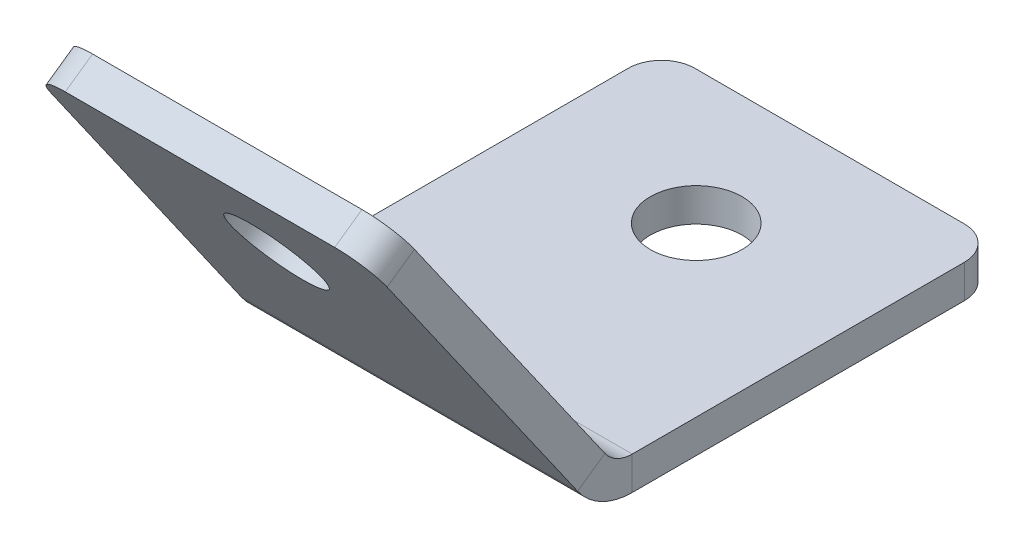
ISO-10303-21;
HEADER;
FILE_DESCRIPTION(('STEP AP214'),'2;1');
FILE_NAME('part.step','',(''),(''),'','','');
FILE_SCHEMA(('AUTOMOTIVE_DESIGN { 1 0 10303 214 1 1 1 1 }'));
ENDSEC;
DATA;
#1=APPLICATION_CONTEXT('core data for automotive mechanical design processes');
#2=APPLICATION_PROTOCOL_DEFINITION('international standard','automotive_design',2000,#1);
#3=PRODUCT_CONTEXT('',#1,'mechanical');
#4=PRODUCT('Part','Part','',(#3));
#5=PRODUCT_RELATED_PRODUCT_CATEGORY('part','',(#4));
#6=PRODUCT_DEFINITION_FORMATION('','',#4);
#7=PRODUCT_DEFINITION_CONTEXT('part definition',#1,'design');
#8=PRODUCT_DEFINITION('design','',#6,#7);
#9=PRODUCT_DEFINITION_SHAPE('','',#8);
#10=(LENGTH_UNIT() NAMED_UNIT(*) SI_UNIT(.MILLI.,.METRE.));
#11=(NAMED_UNIT(*) PLANE_ANGLE_UNIT() SI_UNIT($,.RADIAN.));
#12=(NAMED_UNIT(*) SI_UNIT($,.STERADIAN.) SOLID_ANGLE_UNIT());
#13=UNCERTAINTY_MEASURE_WITH_UNIT(LENGTH_MEASURE(1.E-05),#10,'distance_accuracy_value','');
#14=(GEOMETRIC_REPRESENTATION_CONTEXT(3) GLOBAL_UNCERTAINTY_ASSIGNED_CONTEXT((#13)) GLOBAL_UNIT_ASSIGNED_CONTEXT((#10,
#11,#12)) REPRESENTATION_CONTEXT('',''));
#15=CARTESIAN_POINT('',(0.,0.,0.));
#16=DIRECTION('',(0.,0.,1.));
#17=DIRECTION('',(1.,0.,0.));
#18=AXIS2_PLACEMENT_3D('',#15,#16,#17);
#19=CARTESIAN_POINT('',(32.004,2.70778962917083,1.89601471023151));
#20=DIRECTION('',(1.,0.,0.));
#21=DIRECTION('',(0.,0.,-1.));
#22=AXIS2_PLACEMENT_3D('',#19,#20,#21);
#23=PLANE('',#22);
#24=DIRECTION('',(0.,0.57357643635105,-0.819152044288989));
#25=VECTOR('',#24,1.);
#26=CARTESIAN_POINT('',(32.004,2.70778962917083,1.89601471023151));
#27=LINE('',#26,#25);
#28=CARTESIAN_POINT('',(32.004,2.70778962917083,1.89601471023151));
#29=VERTEX_POINT('',#28);
#30=CARTESIAN_POINT('',(32.004,4.52889481458542,-0.704793030386029));
#31=VERTEX_POINT('',#30);
#32=EDGE_CURVE('E137',#29,#31,#27,.T.);
#33=ORIENTED_EDGE('',*,*,#32,.F.);
#34=CARTESIAN_POINT('',(32.004,6.35,-3.30560077100357));
#35=DIRECTION('',(-1.,0.,0.));
#36=DIRECTION('',(0.,0.,1.));
#37=AXIS2_PLACEMENT_3D('',#34,#35,#36);
#38=CIRCLE('',#37,6.35);
#39=CARTESIAN_POINT('',(32.004,0.,-3.30560077100357));
#40=VERTEX_POINT('',#39);
#41=EDGE_CURVE('E135',#29,#40,#38,.F.);
#42=ORIENTED_EDGE('',*,*,#41,.T.);
#43=DIRECTION('',(0.,-1.,0.));
#44=VECTOR('',#43,1.);
#45=CARTESIAN_POINT('',(32.004,3.175,-3.30560077100357));
#46=LINE('',#45,#44);
#47=CARTESIAN_POINT('',(32.004,3.175,-3.30560077100357));
#48=VERTEX_POINT('',#47);
#49=EDGE_CURVE('E129',#48,#40,#46,.T.);
#50=ORIENTED_EDGE('',*,*,#49,.F.);
#51=CARTESIAN_POINT('',(32.004,6.35,-3.30560077100357));
#52=DIRECTION('',(1.,0.,0.));
#53=DIRECTION('',(0.,0.,-1.));
#54=AXIS2_PLACEMENT_3D('',#51,#52,#53);
#55=CIRCLE('',#54,3.175);
#56=EDGE_CURVE('E133',#31,#48,#55,.T.);
#57=ORIENTED_EDGE('',*,*,#56,.F.);
#58=EDGE_LOOP('',(#33,#42,#50,#57));
#59=FACE_BOUND('',#58,.T.);
#60=ADVANCED_FACE('F36',(#59),#23,.T.);
#61=CARTESIAN_POINT('',(32.004,3.175,-3.30560077100357));
#62=DIRECTION('',(1.,0.,0.));
#63=DIRECTION('',(0.,0.,-1.));
#64=AXIS2_PLACEMENT_3D('',#61,#62,#63);
#65=PLANE('',#64);
#66=DIRECTION('',(0.,-0.819152044288989,-0.57357643635105));
#67=VECTOR('',#66,1.);
#68=CARTESIAN_POINT('',(32.004,1.82110518541458,-2.60080774061754));
#69=LINE('',#68,#67);
#70=CARTESIAN_POINT('',(32.004,30.4299903322075,17.4313492989429));
#71=VERTEX_POINT('',#70);
#72=EDGE_CURVE('E158',#71,#31,#69,.T.);
#73=ORIENTED_EDGE('',*,*,#72,.F.);
#74=DIRECTION('',(0.,0.573576436351052,-0.819152044288988));
#75=VECTOR('',#74,1.);
#76=CARTESIAN_POINT('',(32.004,31.2065524951516,16.3223035938231));
#77=LINE('',#76,#75);
#78=CARTESIAN_POINT('',(32.004,28.6088851467929,20.0321570395604));
#79=VERTEX_POINT('',#78);
#80=EDGE_CURVE('E217',#71,#79,#77,.F.);
#81=ORIENTED_EDGE('',*,*,#80,.T.);
#82=DIRECTION('',(0.,-0.819152044288989,-0.57357643635105));
#83=VECTOR('',#82,1.);
#84=CARTESIAN_POINT('',(32.004,0.,0.));
#85=LINE('',#84,#83);
#86=EDGE_CURVE('E160',#79,#29,#85,.T.);
#87=ORIENTED_EDGE('',*,*,#86,.T.);
#88=ORIENTED_EDGE('',*,*,#32,.T.);
#89=EDGE_LOOP('',(#73,#81,#87,#88));
#90=FACE_BOUND('',#89,.T.);
#91=ADVANCED_FACE('F269',(#90),#65,.T.);
#92=CARTESIAN_POINT('',(0.,0.,-3.30560077100357));
#93=DIRECTION('',(-1.,0.,0.));
#94=DIRECTION('',(0.,0.,1.));
#95=AXIS2_PLACEMENT_3D('',#92,#93,#94);
#96=PLANE('',#95);
#97=DIRECTION('',(0.,1.,0.));
#98=VECTOR('',#97,1.);
#99=CARTESIAN_POINT('',(0.,0.,-3.30560077100357));
#100=LINE('',#99,#98);
#101=CARTESIAN_POINT('',(0.,0.,-3.30560077100357));
#102=VERTEX_POINT('',#101);
#103=CARTESIAN_POINT('',(0.,3.175,-3.30560077100357));
#104=VERTEX_POINT('',#103);
#105=EDGE_CURVE('E138',#102,#104,#100,.T.);
#106=ORIENTED_EDGE('',*,*,#105,.F.);
#107=CARTESIAN_POINT('',(0.,6.35,-3.30560077100357));
#108=DIRECTION('',(-1.,0.,0.));
#109=DIRECTION('',(0.,0.,1.));
#110=AXIS2_PLACEMENT_3D('',#107,#108,#109);
#111=CIRCLE('',#110,6.35);
#112=CARTESIAN_POINT('',(0.,2.70778962917083,1.89601471023151));
#113=VERTEX_POINT('',#112);
#114=EDGE_CURVE('E178',#113,#102,#111,.F.);
#115=ORIENTED_EDGE('',*,*,#114,.F.);
#116=DIRECTION('',(0.,-0.57357643635105,0.819152044288989));
#117=VECTOR('',#116,1.);
#118=CARTESIAN_POINT('',(0.,4.52889481458542,-0.704793030386029));
#119=LINE('',#118,#117);
#120=CARTESIAN_POINT('',(0.,4.52889481458542,-0.704793030386029));
#121=VERTEX_POINT('',#120);
#122=EDGE_CURVE('E197',#121,#113,#119,.T.);
#123=ORIENTED_EDGE('',*,*,#122,.F.);
#124=CARTESIAN_POINT('',(0.,6.35,-3.30560077100357));
#125=DIRECTION('',(1.,0.,0.));
#126=DIRECTION('',(0.,0.,-1.));
#127=AXIS2_PLACEMENT_3D('',#124,#125,#126);
#128=CIRCLE('',#127,3.175);
#129=EDGE_CURVE('E172',#121,#104,#128,.T.);
#130=ORIENTED_EDGE('',*,*,#129,.T.);
#131=EDGE_LOOP('',(#106,#115,#123,#130));
#132=FACE_BOUND('',#131,.T.);
#133=ADVANCED_FACE('F265',(#132),#96,.T.);
#134=CARTESIAN_POINT('',(0.,4.52889481458542,-0.704793030386029));
#135=DIRECTION('',(-1.,0.,0.));
#136=DIRECTION('',(0.,0.,1.));
#137=AXIS2_PLACEMENT_3D('',#134,#135,#136);
#138=PLANE('',#137);
#139=DIRECTION('',(0.,0.,-1.));
#140=VECTOR('',#139,1.);
#141=CARTESIAN_POINT('',(0.,3.175,0.));
#142=LINE('',#141,#140);
#143=CARTESIAN_POINT('',(0.,3.175,-34.925));
#144=VERTEX_POINT('',#143);
#145=EDGE_CURVE('E145',#104,#144,#142,.T.);
#146=ORIENTED_EDGE('',*,*,#145,.T.);
#147=DIRECTION('',(0.,-1.,0.));
#148=VECTOR('',#147,1.);
#149=CARTESIAN_POINT('',(0.,4.52889481458542,-34.925));
#150=LINE('',#149,#148);
#151=CARTESIAN_POINT('',(0.,0.,-34.925));
#152=VERTEX_POINT('',#151);
#153=EDGE_CURVE('E11',#144,#152,#150,.T.);
#154=ORIENTED_EDGE('',*,*,#153,.T.);
#155=DIRECTION('',(0.,0.,-1.));
#156=VECTOR('',#155,1.);
#157=CARTESIAN_POINT('',(0.,0.,0.));
#158=LINE('',#157,#156);
#159=EDGE_CURVE('E167',#102,#152,#158,.T.);
#160=ORIENTED_EDGE('',*,*,#159,.F.);
#161=ORIENTED_EDGE('',*,*,#105,.T.);
#162=EDGE_LOOP('',(#146,#154,#160,#161));
#163=FACE_BOUND('',#162,.T.);
#164=ADVANCED_FACE('F258',(#163),#138,.T.);
#165=CARTESIAN_POINT('',(32.004,0.,0.));
#166=DIRECTION('',(0.,1.,0.));
#167=DIRECTION('',(0.,0.,1.));
#168=AXIS2_PLACEMENT_3D('',#165,#166,#167);
#169=PLANE('',#168);
#170=CARTESIAN_POINT('',(16.002,0.,-25.4));
#171=DIRECTION('',(0.,-1.,0.));
#172=DIRECTION('',(0.,0.,-1.));
#173=AXIS2_PLACEMENT_3D('',#170,#171,#172);
#174=CIRCLE('',#173,4.3688);
#175=CARTESIAN_POINT('',(16.002,0.,-29.7688));
#176=VERTEX_POINT('',#175);
#177=EDGE_CURVE('E208',#176,#176,#174,.T.);
#178=ORIENTED_EDGE('',*,*,#177,.F.);
#179=EDGE_LOOP('',(#178));
#180=FACE_BOUND('',#179,.T.);
#181=DIRECTION('',(-1.,0.,0.));
#182=VECTOR('',#181,1.);
#183=CARTESIAN_POINT('',(32.004,0.,-38.1));
#184=LINE('',#183,#182);
#185=CARTESIAN_POINT('',(28.829,0.,-38.1));
#186=VERTEX_POINT('',#185);
#187=CARTESIAN_POINT('',(3.175,0.,-38.1));
#188=VERTEX_POINT('',#187);
#189=EDGE_CURVE('E194',#186,#188,#184,.T.);
#190=ORIENTED_EDGE('',*,*,#189,.F.);
#191=CARTESIAN_POINT('',(28.829,0.,-34.925));
#192=DIRECTION('',(0.,1.,0.));
#193=DIRECTION('',(0.,0.,1.));
#194=AXIS2_PLACEMENT_3D('',#191,#192,#193);
#195=CIRCLE('',#194,3.175);
#196=CARTESIAN_POINT('',(32.004,0.,-34.925));
#197=VERTEX_POINT('',#196);
#198=EDGE_CURVE('E233',#186,#197,#195,.F.);
#199=ORIENTED_EDGE('',*,*,#198,.T.);
#200=DIRECTION('',(0.,0.,-1.));
#201=VECTOR('',#200,1.);
#202=CARTESIAN_POINT('',(32.004,0.,0.));
#203=LINE('',#202,#201);
#204=EDGE_CURVE('E153',#40,#197,#203,.T.);
#205=ORIENTED_EDGE('',*,*,#204,.F.);
#206=DIRECTION('',(-1.,0.,0.));
#207=VECTOR('',#206,1.);
#208=CARTESIAN_POINT('',(32.004,0.,-3.30560077100357));
#209=LINE('',#208,#207);
#210=EDGE_CURVE('E166',#40,#102,#209,.T.);
#211=ORIENTED_EDGE('',*,*,#210,.T.);
#212=ORIENTED_EDGE('',*,*,#159,.T.);
#213=CARTESIAN_POINT('',(3.175,0.,-34.925));
#214=DIRECTION('',(0.,1.,0.));
#215=DIRECTION('',(0.,0.,1.));
#216=AXIS2_PLACEMENT_3D('',#213,#214,#215);
#217=CIRCLE('',#216,3.175);
#218=EDGE_CURVE('E231',#152,#188,#217,.F.);
#219=ORIENTED_EDGE('',*,*,#218,.T.);
#220=EDGE_LOOP('',(#190,#199,#205,#211,#212,#219));
#221=FACE_BOUND('',#220,.T.);
#222=ADVANCED_FACE('F246',(#180,#221),#169,.F.);
#223=CARTESIAN_POINT('',(32.004,3.175,-38.1));
#224=DIRECTION('',(0.,0.,-1.));
#225=DIRECTION('',(-1.,0.,0.));
#226=AXIS2_PLACEMENT_3D('',#223,#224,#225);
#227=PLANE('',#226);
#228=DIRECTION('',(-1.,0.,0.));
#229=VECTOR('',#228,1.);
#230=CARTESIAN_POINT('',(32.004,3.175,-38.1));
#231=LINE('',#230,#229);
#232=CARTESIAN_POINT('',(28.829,3.175,-38.1));
#233=VERTEX_POINT('',#232);
#234=CARTESIAN_POINT('',(3.175,3.175,-38.1));
#235=VERTEX_POINT('',#234);
#236=EDGE_CURVE('E149',#233,#235,#231,.T.);
#237=ORIENTED_EDGE('',*,*,#236,.F.);
#238=DIRECTION('',(0.,-1.,0.));
#239=VECTOR('',#238,1.);
#240=CARTESIAN_POINT('',(28.829,3.175,-38.1));
#241=LINE('',#240,#239);
#242=EDGE_CURVE('E228',#233,#186,#241,.T.);
#243=ORIENTED_EDGE('',*,*,#242,.T.);
#244=ORIENTED_EDGE('',*,*,#189,.T.);
#245=DIRECTION('',(0.,-1.,0.));
#246=VECTOR('',#245,1.);
#247=CARTESIAN_POINT('',(3.175,3.175,-38.1));
#248=LINE('',#247,#246);
#249=EDGE_CURVE('E226',#188,#235,#248,.F.);
#250=ORIENTED_EDGE('',*,*,#249,.T.);
#251=EDGE_LOOP('',(#237,#243,#244,#250));
#252=FACE_BOUND('',#251,.T.);
#253=ADVANCED_FACE('F240',(#252),#227,.T.);
#254=CARTESIAN_POINT('',(32.004,3.175,0.));
#255=DIRECTION('',(0.,1.,0.));
#256=DIRECTION('',(0.,0.,1.));
#257=AXIS2_PLACEMENT_3D('',#254,#255,#256);
#258=PLANE('',#257);
#259=CARTESIAN_POINT('',(16.002,3.175,-25.4));
#260=DIRECTION('',(0.,1.,0.));
#261=DIRECTION('',(0.,0.,1.));
#262=AXIS2_PLACEMENT_3D('',#259,#260,#261);
#263=CIRCLE('',#262,4.3688);
#264=CARTESIAN_POINT('',(16.002,3.175,-21.0312));
#265=VERTEX_POINT('',#264);
#266=EDGE_CURVE('E204',#265,#265,#263,.T.);
#267=ORIENTED_EDGE('',*,*,#266,.F.);
#268=EDGE_LOOP('',(#267));
#269=FACE_BOUND('',#268,.T.);
#270=DIRECTION('',(0.,0.,-1.));
#271=VECTOR('',#270,1.);
#272=CARTESIAN_POINT('',(32.004,3.175,0.));
#273=LINE('',#272,#271);
#274=CARTESIAN_POINT('',(32.004,3.175,-34.925));
#275=VERTEX_POINT('',#274);
#276=EDGE_CURVE('E143',#48,#275,#273,.T.);
#277=ORIENTED_EDGE('',*,*,#276,.T.);
#278=CARTESIAN_POINT('',(28.829,3.175,-34.925));
#279=DIRECTION('',(0.,1.,0.));
#280=DIRECTION('',(0.,0.,1.));
#281=AXIS2_PLACEMENT_3D('',#278,#279,#280);
#282=CIRCLE('',#281,3.175);
#283=EDGE_CURVE('E44',#275,#233,#282,.T.);
#284=ORIENTED_EDGE('',*,*,#283,.T.);
#285=ORIENTED_EDGE('',*,*,#236,.T.);
#286=CARTESIAN_POINT('',(3.175,3.175,-34.925));
#287=DIRECTION('',(0.,1.,0.));
#288=DIRECTION('',(0.,0.,1.));
#289=AXIS2_PLACEMENT_3D('',#286,#287,#288);
#290=CIRCLE('',#289,3.175);
#291=EDGE_CURVE('E51',#235,#144,#290,.T.);
#292=ORIENTED_EDGE('',*,*,#291,.T.);
#293=ORIENTED_EDGE('',*,*,#145,.F.);
#294=DIRECTION('',(-1.,0.,0.));
#295=VECTOR('',#294,1.);
#296=CARTESIAN_POINT('',(32.004,3.175,-3.30560077100357));
#297=LINE('',#296,#295);
#298=EDGE_CURVE('E141',#48,#104,#297,.T.);
#299=ORIENTED_EDGE('',*,*,#298,.F.);
#300=EDGE_LOOP('',(#277,#284,#285,#292,#293,#299));
#301=FACE_BOUND('',#300,.T.);
#302=ADVANCED_FACE('F142',(#269,#301),#258,.T.);
#303=CARTESIAN_POINT('',(32.004,6.35,-3.30560077100357));
#304=DIRECTION('',(-1.,0.,0.));
#305=DIRECTION('',(0.,0.,1.));
#306=AXIS2_PLACEMENT_3D('',#303,#304,#305);
#307=CYLINDRICAL_SURFACE('',#306,3.175);
#308=ORIENTED_EDGE('',*,*,#129,.F.);
#309=DIRECTION('',(-1.,0.,0.));
#310=VECTOR('',#309,1.);
#311=CARTESIAN_POINT('',(32.004,4.52889481458542,-0.704793030386029));
#312=LINE('',#311,#310);
#313=EDGE_CURVE('E150',#31,#121,#312,.T.);
#314=ORIENTED_EDGE('',*,*,#313,.F.);
#315=ORIENTED_EDGE('',*,*,#56,.T.);
#316=ORIENTED_EDGE('',*,*,#298,.T.);
#317=EDGE_LOOP('',(#308,#314,#315,#316));
#318=FACE_BOUND('',#317,.T.);
#319=ADVANCED_FACE('F156',(#318),#307,.F.);
#320=CARTESIAN_POINT('',(32.004,1.82110518541458,-2.60080774061754));
#321=DIRECTION('',(0.,0.57357643635105,-0.819152044288989));
#322=DIRECTION('',(0.,0.819152044288989,0.57357643635105));
#323=AXIS2_PLACEMENT_3D('',#320,#321,#322);
#324=PLANE('',#323);
#325=CARTESIAN_POINT('',(16.002,22.6275671103549,11.9680337426991));
#326=DIRECTION('',(0.,0.57357643635105,-0.819152044288989));
#327=DIRECTION('',(0.,0.819152044288989,0.57357643635105));
#328=AXIS2_PLACEMENT_3D('',#325,#326,#327);
#329=CIRCLE('',#328,4.3688);
#330=CARTESIAN_POINT('',(16.002,19.0488556592652,9.46219300756867));
#331=VERTEX_POINT('',#330);
#332=EDGE_CURVE('E170',#331,#331,#329,.T.);
#333=ORIENTED_EDGE('',*,*,#332,.F.);
#334=EDGE_LOOP('',(#333));
#335=FACE_BOUND('',#334,.T.);
#336=DIRECTION('',(-1.,0.,0.));
#337=VECTOR('',#336,1.);
#338=CARTESIAN_POINT('',(32.004,33.0307980728251,19.2524544843575));
#339=LINE('',#338,#337);
#340=CARTESIAN_POINT('',(28.829,33.0307980728251,19.2524544843575));
#341=VERTEX_POINT('',#340);
#342=CARTESIAN_POINT('',(3.175,33.0307980728251,19.2524544843575));
#343=VERTEX_POINT('',#342);
#344=EDGE_CURVE('E189',#341,#343,#339,.T.);
#345=ORIENTED_EDGE('',*,*,#344,.F.);
#346=CARTESIAN_POINT('',(28.829,30.4299903322075,17.4313492989429));
#347=DIRECTION('',(0.,0.57357643635105,-0.819152044288989));
#348=DIRECTION('',(0.,0.819152044288989,0.57357643635105));
#349=AXIS2_PLACEMENT_3D('',#346,#347,#348);
#350=CIRCLE('',#349,3.175);
#351=EDGE_CURVE('E215',#341,#71,#350,.T.);
#352=ORIENTED_EDGE('',*,*,#351,.T.);
#353=ORIENTED_EDGE('',*,*,#72,.T.);
#354=ORIENTED_EDGE('',*,*,#313,.T.);
#355=DIRECTION('',(0.,-0.819152044288989,-0.57357643635105));
#356=VECTOR('',#355,1.);
#357=CARTESIAN_POINT('',(0.,1.82110518541458,-2.60080774061754));
#358=LINE('',#357,#356);
#359=CARTESIAN_POINT('',(0.,30.4299903322075,17.4313492989429));
#360=VERTEX_POINT('',#359);
#361=EDGE_CURVE('E174',#360,#121,#358,.T.);
#362=ORIENTED_EDGE('',*,*,#361,.F.);
#363=CARTESIAN_POINT('',(3.175,30.4299903322075,17.4313492989429));
#364=DIRECTION('',(0.,0.57357643635105,-0.819152044288989));
#365=DIRECTION('',(0.,0.819152044288989,0.57357643635105));
#366=AXIS2_PLACEMENT_3D('',#363,#364,#365);
#367=CIRCLE('',#366,3.175);
#368=EDGE_CURVE('E213',#360,#343,#367,.T.);
#369=ORIENTED_EDGE('',*,*,#368,.T.);
#370=EDGE_LOOP('',(#345,#352,#353,#354,#362,#369));
#371=FACE_BOUND('',#370,.T.);
#372=ADVANCED_FACE('F305',(#335,#371),#324,.T.);
#373=CARTESIAN_POINT('',(32.004,31.2096928874105,21.853262224975));
#374=DIRECTION('',(0.,0.819152044288988,0.573576436351052));
#375=DIRECTION('',(0.,-0.573576436351052,0.819152044288988));
#376=AXIS2_PLACEMENT_3D('',#373,#374,#375);
#377=PLANE('',#376);
#378=DIRECTION('',(-1.,0.,0.));
#379=VECTOR('',#378,1.);
#380=CARTESIAN_POINT('',(32.004,31.2096928874105,21.853262224975));
#381=LINE('',#380,#379);
#382=CARTESIAN_POINT('',(28.829,31.2096928874105,21.853262224975));
#383=VERTEX_POINT('',#382);
#384=CARTESIAN_POINT('',(3.175,31.2096928874105,21.853262224975));
#385=VERTEX_POINT('',#384);
#386=EDGE_CURVE('E186',#383,#385,#381,.T.);
#387=ORIENTED_EDGE('',*,*,#386,.F.);
#388=DIRECTION('',(0.,0.573576436351052,-0.819152044288988));
#389=VECTOR('',#388,1.);
#390=CARTESIAN_POINT('',(28.829,31.2096928874105,21.853262224975));
#391=LINE('',#390,#389);
#392=EDGE_CURVE('E210',#383,#341,#391,.T.);
#393=ORIENTED_EDGE('',*,*,#392,.T.);
#394=ORIENTED_EDGE('',*,*,#344,.T.);
#395=DIRECTION('',(0.,0.573576436351052,-0.819152044288988));
#396=VECTOR('',#395,1.);
#397=CARTESIAN_POINT('',(3.175,31.2096928874105,21.853262224975));
#398=LINE('',#397,#396);
#399=EDGE_CURVE('E203',#343,#385,#398,.F.);
#400=ORIENTED_EDGE('',*,*,#399,.T.);
#401=EDGE_LOOP('',(#387,#393,#394,#400));
#402=FACE_BOUND('',#401,.T.);
#403=ADVANCED_FACE('F318',(#402),#377,.T.);
#404=CARTESIAN_POINT('',(32.004,0.,0.));
#405=DIRECTION('',(0.,0.57357643635105,-0.819152044288989));
#406=DIRECTION('',(0.,0.819152044288989,0.57357643635105));
#407=AXIS2_PLACEMENT_3D('',#404,#405,#406);
#408=PLANE('',#407);
#409=CARTESIAN_POINT('',(16.002,20.8064619249403,14.5688414833167));
#410=DIRECTION('',(0.,-0.57357643635105,0.819152044288989));
#411=DIRECTION('',(0.,-0.819152044288989,-0.57357643635105));
#412=AXIS2_PLACEMENT_3D('',#409,#410,#411);
#413=CIRCLE('',#412,4.3688);
#414=CARTESIAN_POINT('',(16.002,17.2277504738506,12.0630007481862));
#415=VERTEX_POINT('',#414);
#416=EDGE_CURVE('E207',#415,#415,#413,.T.);
#417=ORIENTED_EDGE('',*,*,#416,.F.);
#418=EDGE_LOOP('',(#417));
#419=FACE_BOUND('',#418,.T.);
#420=ORIENTED_EDGE('',*,*,#86,.F.);
#421=CARTESIAN_POINT('',(28.829,28.6088851467929,20.0321570395604));
#422=DIRECTION('',(0.,0.57357643635105,-0.819152044288989));
#423=DIRECTION('',(0.,0.819152044288989,0.57357643635105));
#424=AXIS2_PLACEMENT_3D('',#421,#422,#423);
#425=CIRCLE('',#424,3.175);
#426=EDGE_CURVE('E221',#79,#383,#425,.F.);
#427=ORIENTED_EDGE('',*,*,#426,.T.);
#428=ORIENTED_EDGE('',*,*,#386,.T.);
#429=CARTESIAN_POINT('',(3.175,28.6088851467929,20.0321570395604));
#430=DIRECTION('',(0.,0.57357643635105,-0.819152044288989));
#431=DIRECTION('',(0.,0.819152044288989,0.57357643635105));
#432=AXIS2_PLACEMENT_3D('',#429,#430,#431);
#433=CIRCLE('',#432,3.175);
#434=CARTESIAN_POINT('',(0.,28.6088851467929,20.0321570395604));
#435=VERTEX_POINT('',#434);
#436=EDGE_CURVE('E219',#385,#435,#433,.F.);
#437=ORIENTED_EDGE('',*,*,#436,.T.);
#438=DIRECTION('',(0.,-0.819152044288989,-0.57357643635105));
#439=VECTOR('',#438,1.);
#440=CARTESIAN_POINT('',(0.,0.,0.));
#441=LINE('',#440,#439);
#442=EDGE_CURVE('E176',#435,#113,#441,.T.);
#443=ORIENTED_EDGE('',*,*,#442,.T.);
#444=DIRECTION('',(-1.,0.,0.));
#445=VECTOR('',#444,1.);
#446=CARTESIAN_POINT('',(32.004,2.70778962917083,1.89601471023151));
#447=LINE('',#446,#445);
#448=EDGE_CURVE('E183',#29,#113,#447,.T.);
#449=ORIENTED_EDGE('',*,*,#448,.F.);
#450=EDGE_LOOP('',(#420,#427,#428,#437,#443,#449));
#451=FACE_BOUND('',#450,.T.);
#452=ADVANCED_FACE('F310',(#419,#451),#408,.F.);
#453=CARTESIAN_POINT('',(32.004,6.35,-3.30560077100357));
#454=DIRECTION('',(-1.,0.,0.));
#455=DIRECTION('',(0.,0.,1.));
#456=AXIS2_PLACEMENT_3D('',#453,#454,#455);
#457=CYLINDRICAL_SURFACE('',#456,6.35);
#458=ORIENTED_EDGE('',*,*,#114,.T.);
#459=ORIENTED_EDGE('',*,*,#210,.F.);
#460=ORIENTED_EDGE('',*,*,#41,.F.);
#461=ORIENTED_EDGE('',*,*,#448,.T.);
#462=EDGE_LOOP('',(#458,#459,#460,#461));
#463=FACE_BOUND('',#462,.T.);
#464=ADVANCED_FACE('F295',(#463),#457,.T.);
#465=CARTESIAN_POINT('',(32.004,6.35,-3.30560077100357));
#466=DIRECTION('',(1.,0.,0.));
#467=DIRECTION('',(0.,0.,-1.));
#468=AXIS2_PLACEMENT_3D('',#465,#466,#467);
#469=PLANE('',#468);
#470=ORIENTED_EDGE('',*,*,#204,.T.);
#471=DIRECTION('',(0.,-1.,0.));
#472=VECTOR('',#471,1.);
#473=CARTESIAN_POINT('',(32.004,6.35,-34.925));
#474=LINE('',#473,#472);
#475=EDGE_CURVE('E59',#197,#275,#474,.F.);
#476=ORIENTED_EDGE('',*,*,#475,.T.);
#477=ORIENTED_EDGE('',*,*,#276,.F.);
#478=ORIENTED_EDGE('',*,*,#49,.T.);
#479=EDGE_LOOP('',(#470,#476,#477,#478));
#480=FACE_BOUND('',#479,.T.);
#481=ADVANCED_FACE('F152',(#480),#469,.T.);
#482=CARTESIAN_POINT('',(0.,6.35,-3.30560077100357));
#483=DIRECTION('',(1.,0.,0.));
#484=DIRECTION('',(0.,0.,-1.));
#485=AXIS2_PLACEMENT_3D('',#482,#483,#484);
#486=PLANE('',#485);
#487=ORIENTED_EDGE('',*,*,#442,.F.);
#488=DIRECTION('',(0.,0.573576436351052,-0.819152044288988));
#489=VECTOR('',#488,1.);
#490=CARTESIAN_POINT('',(0.,30.4299903322075,17.4313492989429));
#491=LINE('',#490,#489);
#492=EDGE_CURVE('E223',#435,#360,#491,.T.);
#493=ORIENTED_EDGE('',*,*,#492,.T.);
#494=ORIENTED_EDGE('',*,*,#361,.T.);
#495=ORIENTED_EDGE('',*,*,#122,.T.);
#496=EDGE_LOOP('',(#487,#493,#494,#495));
#497=FACE_BOUND('',#496,.T.);
#498=ADVANCED_FACE('F314',(#497),#486,.F.);
#499=CARTESIAN_POINT('',(16.002,49.5744062418102,-26.5160408508888));
#500=DIRECTION('',(0.,-0.57357643635105,0.819152044288989));
#501=DIRECTION('',(0.,-0.819152044288989,-0.57357643635105));
#502=AXIS2_PLACEMENT_3D('',#499,#500,#501);
#503=CYLINDRICAL_SURFACE('',#502,4.3688);
#504=CARTESIAN_POINT('',(16.002,19.0488556592652,9.46219300756867));
#505=CARTESIAN_POINT('',(16.002,19.0298858135838,9.48928475486677));
#506=CARTESIAN_POINT('',(16.002,19.0109159679024,9.51637650216487));
#507=CARTESIAN_POINT('',(16.002,18.9729762765396,9.57055999676107));
#508=CARTESIAN_POINT('',(16.002,18.9540064308582,9.59765174405917));
#509=CARTESIAN_POINT('',(16.002,18.9160667394954,9.65183523865537));
#510=CARTESIAN_POINT('',(16.002,18.897096893814,9.67892698595347));
#511=CARTESIAN_POINT('',(16.002,18.8591572024512,9.73311048054966));
#512=CARTESIAN_POINT('',(16.002,18.8401873567698,9.76020222784776));
#513=CARTESIAN_POINT('',(16.002,18.8022476654069,9.81438572244396));
#514=CARTESIAN_POINT('',(16.002,18.7832778197255,9.84147746974206));
#515=CARTESIAN_POINT('',(16.002,18.7453381283627,9.89566096433826));
#516=CARTESIAN_POINT('',(16.002,18.7263682826813,9.92275271163636));
#517=CARTESIAN_POINT('',(16.002,18.6884285913185,9.97693620623256));
#518=CARTESIAN_POINT('',(16.002,18.6694587456371,10.0040279535307));
#519=CARTESIAN_POINT('',(16.002,18.6315190542743,10.0582114481269));
#520=CARTESIAN_POINT('',(16.002,18.6125492085929,10.085303195425));
#521=CARTESIAN_POINT('',(16.002,18.5746095172301,10.1394866900212));
#522=CARTESIAN_POINT('',(16.002,18.5556396715487,10.1665784373193));
#523=CARTESIAN_POINT('',(16.002,18.5176999801859,10.2207619319155));
#524=CARTESIAN_POINT('',(16.002,18.4987301345045,10.2478536792136));
#525=CARTESIAN_POINT('',(16.002,18.4607904431417,10.3020371738097));
#526=CARTESIAN_POINT('',(16.002,18.4418205974603,10.3291289211078));
#527=CARTESIAN_POINT('',(16.002,18.4038809060975,10.383312415704));
#528=CARTESIAN_POINT('',(16.002,18.3849110604161,10.4104041630021));
#529=CARTESIAN_POINT('',(16.002,18.3469713690533,10.4645876575983));
#530=CARTESIAN_POINT('',(16.002,18.3280015233719,10.4916794048964));
#531=CARTESIAN_POINT('',(16.002,18.2900618320091,10.5458628994926));
#532=CARTESIAN_POINT('',(16.002,18.2710919863277,10.5729546467907));
#533=CARTESIAN_POINT('',(16.002,18.2331522949649,10.6271381413869));
#534=CARTESIAN_POINT('',(16.002,18.2141824492835,10.654229888685));
#535=CARTESIAN_POINT('',(16.002,18.1762427579207,10.7084133832812));
#536=CARTESIAN_POINT('',(16.002,18.1572729122393,10.7355051305793));
#537=CARTESIAN_POINT('',(16.002,18.1193332208765,10.7896886251755));
#538=CARTESIAN_POINT('',(16.002,18.1003633751951,10.8167803724736));
#539=CARTESIAN_POINT('',(16.002,18.0624236838323,10.8709638670698));
#540=CARTESIAN_POINT('',(16.002,18.0434538381509,10.8980556143679));
#541=CARTESIAN_POINT('',(16.002,18.0055141467881,10.9522391089641));
#542=CARTESIAN_POINT('',(16.002,17.9865443011067,10.9793308562622));
#543=CARTESIAN_POINT('',(16.002,17.9486046097439,11.0335143508584));
#544=CARTESIAN_POINT('',(16.002,17.9296347640625,11.0606060981565));
#545=CARTESIAN_POINT('',(16.002,17.8916950726997,11.1147895927527));
#546=CARTESIAN_POINT('',(16.002,17.8727252270183,11.1418813400508));
#547=CARTESIAN_POINT('',(16.002,17.8347855356555,11.196064834647));
#548=CARTESIAN_POINT('',(16.002,17.815815689974,11.2231565819451));
#549=CARTESIAN_POINT('',(16.002,17.7778759986112,11.2773400765413));
#550=CARTESIAN_POINT('',(16.002,17.7589061529298,11.3044318238394));
#551=CARTESIAN_POINT('',(16.002,17.720966461567,11.3586153184356));
#552=CARTESIAN_POINT('',(16.002,17.7019966158856,11.3857070657337));
#553=CARTESIAN_POINT('',(16.002,17.6640569245228,11.4398905603299));
#554=CARTESIAN_POINT('',(16.002,17.6450870788414,11.466982307628));
#555=CARTESIAN_POINT('',(16.002,17.6071473874786,11.5211658022242));
#556=CARTESIAN_POINT('',(16.002,17.5881775417972,11.5482575495223));
#557=CARTESIAN_POINT('',(16.002,17.5502378504344,11.6024410441185));
#558=CARTESIAN_POINT('',(16.002,17.531268004753,11.6295327914166));
#559=CARTESIAN_POINT('',(16.002,17.4933283133902,11.6837162860128));
#560=CARTESIAN_POINT('',(16.002,17.4743584677088,11.7108080333109));
#561=CARTESIAN_POINT('',(16.002,17.436418776346,11.7649915279071));
#562=CARTESIAN_POINT('',(16.002,17.4174489306646,11.7920832752052));
#563=CARTESIAN_POINT('',(16.002,17.3795092393018,11.8462667698014));
#564=CARTESIAN_POINT('',(16.002,17.3605393936204,11.8733585170995));
#565=CARTESIAN_POINT('',(16.002,17.3225997022576,11.9275420116957));
#566=CARTESIAN_POINT('',(16.002,17.3036298565762,11.9546337589938));
#567=CARTESIAN_POINT('',(16.002,17.2656901652134,12.00881725359));
#568=CARTESIAN_POINT('',(16.002,17.246720319532,12.0359090008881));
#569=CARTESIAN_POINT('',(16.002,17.2277504738506,12.0630007481862));
#570=B_SPLINE_CURVE_WITH_KNOTS('',3,(#504,#505,#506,#507,#508,#509,#510,#511,#512,#513,#514,
#515,#516,#517,#518,#519,#520,#521,#522,#523,#524,#525,#526,#527,#528,#529,#530,#531,#532,#533,
#534,#535,#536,#537,#538,#539,#540,#541,#542,#543,#544,#545,#546,#547,#548,#549,#550,#551,#552,
#553,#554,#555,#556,#557,#558,#559,#560,#561,#562,#563,#564,#565,#566,#567,#568,#569),
.UNSPECIFIED.,.F.,.F.,(4,2,2,2,2,2,2,2,2,2,2,2,2,2,2,2,2,2,2,2,2,2,2,2,2,2,2,2,2,2,2,2,4),(0.,
0.099218749999997,0.198437500000002,0.297656249999997,0.396874999999994,0.496093749999999,
0.595312500000001,0.694531249999998,0.793749999999995,0.89296875,0.992187499999997,
1.09140624999999,1.190625,1.28984375,1.3890625,1.48828125,1.5875,1.68671875,1.7859375,
1.88515625,1.98437499999999,2.08359375,2.1828125,2.28203125,2.38125,2.48046875,2.57968749999999,
2.67890624999999,2.77812499999999,2.87734375,2.97656249999999,3.07578125,3.175),.UNSPECIFIED.);
#571=EDGE_CURVE('BSEAM341',#331,#415,#570,.T.);
#572=ORIENTED_EDGE('',*,*,#332,.T.);
#573=ORIENTED_EDGE('',*,*,#416,.T.);
#574=ORIENTED_EDGE('',*,*,#571,.T.);
#575=ORIENTED_EDGE('',*,*,#571,.F.);
#576=EDGE_LOOP('',(#572,#574,#573,#575));
#577=FACE_BOUND('',#576,.T.);
#578=ADVANCED_FACE('F341',(#577),#503,.F.);
#579=CARTESIAN_POINT('',(16.002,33.0307980728251,-25.4));
#580=DIRECTION('',(0.,-1.,0.));
#581=DIRECTION('',(0.,0.,-1.));
#582=AXIS2_PLACEMENT_3D('',#579,#580,#581);
#583=CYLINDRICAL_SURFACE('',#582,4.3688);
#584=ORIENTED_EDGE('',*,*,#266,.T.);
#585=EDGE_LOOP('',(#584));
#586=FACE_BOUND('',#585,.T.);
#587=ORIENTED_EDGE('',*,*,#177,.T.);
#588=EDGE_LOOP('',(#587));
#589=FACE_BOUND('',#588,.T.);
#590=ADVANCED_FACE('F255',(#586,#589),#583,.F.);
#591=CARTESIAN_POINT('',(28.829,28.6088851467929,20.0321570395604));
#592=DIRECTION('',(0.,0.573576436351052,-0.819152044288988));
#593=DIRECTION('',(0.,0.819152044288988,0.573576436351052));
#594=AXIS2_PLACEMENT_3D('',#591,#592,#593);
#595=CYLINDRICAL_SURFACE('',#594,3.175);
#596=ORIENTED_EDGE('',*,*,#426,.F.);
#597=ORIENTED_EDGE('',*,*,#80,.F.);
#598=ORIENTED_EDGE('',*,*,#351,.F.);
#599=ORIENTED_EDGE('',*,*,#392,.F.);
#600=EDGE_LOOP('',(#596,#597,#598,#599));
#601=FACE_BOUND('',#600,.T.);
#602=ADVANCED_FACE('F278',(#601),#595,.T.);
#603=CARTESIAN_POINT('',(3.175,32.2510955176221,14.8305415583254));
#604=DIRECTION('',(0.,-0.573576436351052,0.819152044288988));
#605=DIRECTION('',(0.,-0.819152044288988,-0.573576436351052));
#606=AXIS2_PLACEMENT_3D('',#603,#604,#605);
#607=CYLINDRICAL_SURFACE('',#606,3.175);
#608=ORIENTED_EDGE('',*,*,#436,.F.);
#609=ORIENTED_EDGE('',*,*,#399,.F.);
#610=ORIENTED_EDGE('',*,*,#368,.F.);
#611=ORIENTED_EDGE('',*,*,#492,.F.);
#612=EDGE_LOOP('',(#608,#609,#610,#611));
#613=FACE_BOUND('',#612,.T.);
#614=ADVANCED_FACE('F281',(#613),#607,.T.);
#615=CARTESIAN_POINT('',(28.829,3.175,-34.925));
#616=DIRECTION('',(0.,-1.,0.));
#617=DIRECTION('',(0.,0.,-1.));
#618=AXIS2_PLACEMENT_3D('',#615,#616,#617);
#619=CYLINDRICAL_SURFACE('',#618,3.175);
#620=ORIENTED_EDGE('',*,*,#283,.F.);
#621=ORIENTED_EDGE('',*,*,#475,.F.);
#622=ORIENTED_EDGE('',*,*,#198,.F.);
#623=ORIENTED_EDGE('',*,*,#242,.F.);
#624=EDGE_LOOP('',(#620,#621,#622,#623));
#625=FACE_BOUND('',#624,.T.);
#626=ADVANCED_FACE('F243',(#625),#619,.T.);
#627=CARTESIAN_POINT('',(3.175,4.52889481458542,-34.925));
#628=DIRECTION('',(0.,-1.,0.));
#629=DIRECTION('',(0.,0.,-1.));
#630=AXIS2_PLACEMENT_3D('',#627,#628,#629);
#631=CYLINDRICAL_SURFACE('',#630,3.175);
#632=ORIENTED_EDGE('',*,*,#291,.F.);
#633=ORIENTED_EDGE('',*,*,#249,.F.);
#634=ORIENTED_EDGE('',*,*,#218,.F.);
#635=ORIENTED_EDGE('',*,*,#153,.F.);
#636=EDGE_LOOP('',(#632,#633,#634,#635));
#637=FACE_BOUND('',#636,.T.);
#638=ADVANCED_FACE('F38',(#637),#631,.T.);
#639=CLOSED_SHELL('',(#60,#91,#133,#164,#222,#253,#302,#319,#372,#403,#452,#464,#481,#498,#578,
#590,#602,#614,#626,#638));
#640=MANIFOLD_SOLID_BREP('B2',#639);
#641=ADVANCED_BREP_SHAPE_REPRESENTATION('',(#18,#640),#14);
#642=SHAPE_DEFINITION_REPRESENTATION(#9,#641);
ENDSEC;
END-ISO-10303-21;
